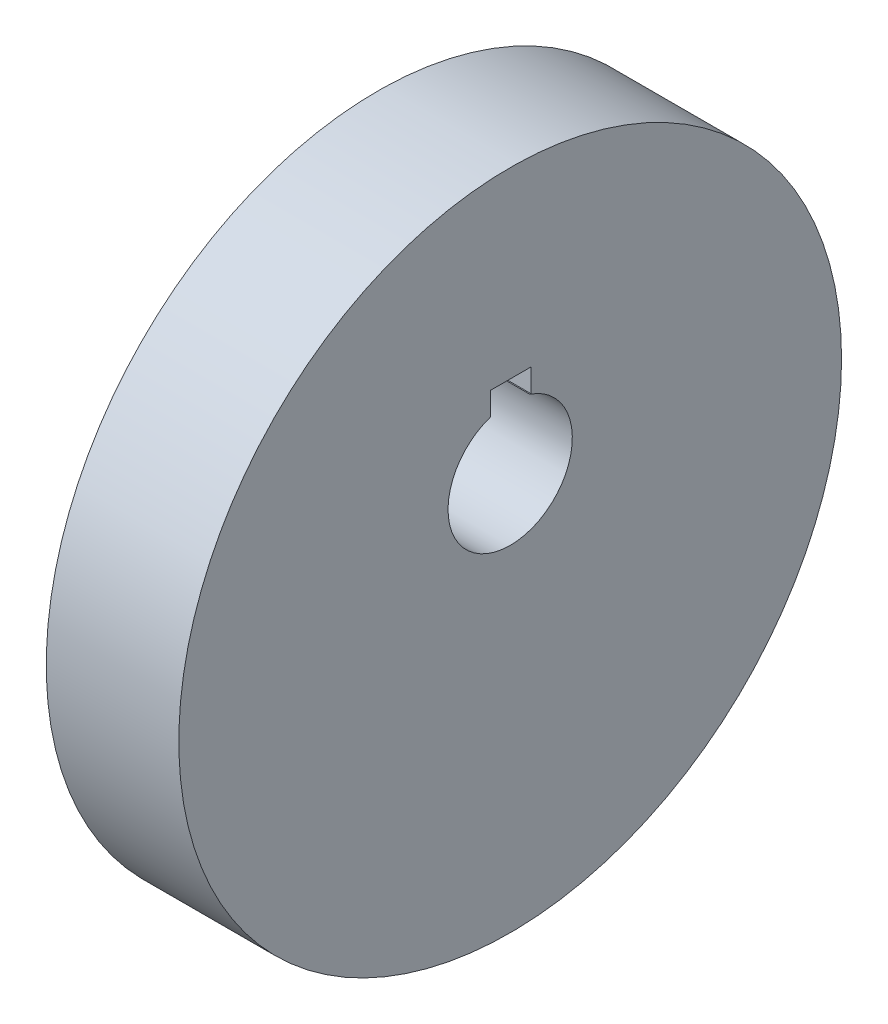
ISO-10303-21;
HEADER;
FILE_DESCRIPTION(('STEP AP214'),'2;1');
FILE_NAME('part.step','',(''),(''),'','','');
FILE_SCHEMA(('AUTOMOTIVE_DESIGN { 1 0 10303 214 1 1 1 1 }'));
ENDSEC;
DATA;
#1=APPLICATION_CONTEXT('core data for automotive mechanical design processes');
#2=APPLICATION_PROTOCOL_DEFINITION('international standard','automotive_design',2000,#1);
#3=PRODUCT_CONTEXT('',#1,'mechanical');
#4=PRODUCT('Part','Part','',(#3));
#5=PRODUCT_RELATED_PRODUCT_CATEGORY('part','',(#4));
#6=PRODUCT_DEFINITION_FORMATION('','',#4);
#7=PRODUCT_DEFINITION_CONTEXT('part definition',#1,'design');
#8=PRODUCT_DEFINITION('design','',#6,#7);
#9=PRODUCT_DEFINITION_SHAPE('','',#8);
#10=(LENGTH_UNIT() NAMED_UNIT(*) SI_UNIT(.MILLI.,.METRE.));
#11=(NAMED_UNIT(*) PLANE_ANGLE_UNIT() SI_UNIT($,.RADIAN.));
#12=(NAMED_UNIT(*) SI_UNIT($,.STERADIAN.) SOLID_ANGLE_UNIT());
#13=UNCERTAINTY_MEASURE_WITH_UNIT(LENGTH_MEASURE(1.E-05),#10,'distance_accuracy_value','');
#14=(GEOMETRIC_REPRESENTATION_CONTEXT(3) GLOBAL_UNCERTAINTY_ASSIGNED_CONTEXT((#13)) GLOBAL_UNIT_ASSIGNED_CONTEXT((#10,
#11,#12)) REPRESENTATION_CONTEXT('',''));
#15=CARTESIAN_POINT('',(0.,0.,0.));
#16=DIRECTION('',(0.,0.,1.));
#17=DIRECTION('',(1.,0.,0.));
#18=AXIS2_PLACEMENT_3D('',#15,#16,#17);
#19=CARTESIAN_POINT('',(10.16,0.,0.));
#20=DIRECTION('',(1.,0.,0.));
#21=DIRECTION('',(0.,0.,-1.));
#22=AXIS2_PLACEMENT_3D('',#19,#20,#21);
#23=PLANE('',#22);
#24=CARTESIAN_POINT('',(10.16,0.,0.));
#25=DIRECTION('',(1.,0.,0.));
#26=DIRECTION('',(0.,0.,-1.));
#27=AXIS2_PLACEMENT_3D('',#24,#25,#26);
#28=CIRCLE('',#27,25.4);
#29=CARTESIAN_POINT('',(10.16,0.,-25.4));
#30=VERTEX_POINT('',#29);
#31=EDGE_CURVE('E47',#30,#30,#28,.T.);
#32=ORIENTED_EDGE('',*,*,#31,.T.);
#33=EDGE_LOOP('',(#32));
#34=FACE_BOUND('',#33,.T.);
#35=DIRECTION('',(0.,1.,0.));
#36=VECTOR('',#35,1.);
#37=CARTESIAN_POINT('',(10.16,9.59810420696557,-1.5875));
#38=LINE('',#37,#36);
#39=CARTESIAN_POINT('',(10.16,9.59810420696557,-1.5875));
#40=VERTEX_POINT('',#39);
#41=CARTESIAN_POINT('',(10.16,11.3665,-1.5875));
#42=VERTEX_POINT('',#41);
#43=EDGE_CURVE('E92',#40,#42,#38,.T.);
#44=ORIENTED_EDGE('',*,*,#43,.F.);
#45=DIRECTION('',(0.,0.,-1.));
#46=VECTOR('',#45,1.);
#47=CARTESIAN_POINT('',(10.16,9.59810420696557,1.50603473565519));
#48=LINE('',#47,#46);
#49=CARTESIAN_POINT('',(10.16,9.59810420696557,-1.50603473565519));
#50=VERTEX_POINT('',#49);
#51=EDGE_CURVE('E83',#50,#40,#48,.T.);
#52=ORIENTED_EDGE('',*,*,#51,.F.);
#53=CARTESIAN_POINT('',(10.16,5.08,0.));
#54=DIRECTION('',(1.,0.,0.));
#55=DIRECTION('',(0.,0.,-1.));
#56=AXIS2_PLACEMENT_3D('',#53,#54,#55);
#57=CIRCLE('',#56,4.7625);
#58=CARTESIAN_POINT('',(10.16,9.59810420696557,1.50603473565519));
#59=VERTEX_POINT('',#58);
#60=EDGE_CURVE('E122',#59,#50,#57,.T.);
#61=ORIENTED_EDGE('',*,*,#60,.F.);
#62=DIRECTION('',(0.,-1.,0.));
#63=VECTOR('',#62,1.);
#64=CARTESIAN_POINT('',(10.16,9.59810420696557,1.50603473565519));
#65=LINE('',#64,#63);
#66=CARTESIAN_POINT('',(10.16,11.3665,1.50603473565519));
#67=VERTEX_POINT('',#66);
#68=EDGE_CURVE('E54',#67,#59,#65,.T.);
#69=ORIENTED_EDGE('',*,*,#68,.F.);
#70=DIRECTION('',(0.,0.,1.));
#71=VECTOR('',#70,1.);
#72=CARTESIAN_POINT('',(10.16,11.3665,1.50603473565519));
#73=LINE('',#72,#71);
#74=EDGE_CURVE('E104',#42,#67,#73,.T.);
#75=ORIENTED_EDGE('',*,*,#74,.F.);
#76=EDGE_LOOP('',(#44,#52,#61,#69,#75));
#77=FACE_BOUND('',#76,.T.);
#78=ADVANCED_FACE('F39',(#34,#77),#23,.T.);
#79=CARTESIAN_POINT('',(0.,0.,0.));
#80=DIRECTION('',(1.,0.,0.));
#81=DIRECTION('',(0.,0.,-1.));
#82=AXIS2_PLACEMENT_3D('',#79,#80,#81);
#83=PLANE('',#82);
#84=CARTESIAN_POINT('',(0.,0.,0.));
#85=DIRECTION('',(1.,0.,0.));
#86=DIRECTION('',(0.,0.,-1.));
#87=AXIS2_PLACEMENT_3D('',#84,#85,#86);
#88=CIRCLE('',#87,25.4);
#89=CARTESIAN_POINT('',(0.,0.,-25.4));
#90=VERTEX_POINT('',#89);
#91=EDGE_CURVE('E124',#90,#90,#88,.T.);
#92=ORIENTED_EDGE('',*,*,#91,.F.);
#93=EDGE_LOOP('',(#92));
#94=FACE_BOUND('',#93,.T.);
#95=DIRECTION('',(0.,0.,-1.));
#96=VECTOR('',#95,1.);
#97=CARTESIAN_POINT('',(0.,9.59810420696557,1.50603473565519));
#98=LINE('',#97,#96);
#99=CARTESIAN_POINT('',(0.,9.59810420696557,-1.50603473565519));
#100=VERTEX_POINT('',#99);
#101=CARTESIAN_POINT('',(0.,9.59810420696557,-1.5875));
#102=VERTEX_POINT('',#101);
#103=EDGE_CURVE('E110',#100,#102,#98,.T.);
#104=ORIENTED_EDGE('',*,*,#103,.T.);
#105=DIRECTION('',(0.,1.,0.));
#106=VECTOR('',#105,1.);
#107=CARTESIAN_POINT('',(0.,9.59810420696557,-1.5875));
#108=LINE('',#107,#106);
#109=CARTESIAN_POINT('',(0.,11.3665,-1.5875));
#110=VERTEX_POINT('',#109);
#111=EDGE_CURVE('E99',#102,#110,#108,.T.);
#112=ORIENTED_EDGE('',*,*,#111,.T.);
#113=DIRECTION('',(0.,0.,1.));
#114=VECTOR('',#113,1.);
#115=CARTESIAN_POINT('',(0.,11.3665,1.50603473565519));
#116=LINE('',#115,#114);
#117=CARTESIAN_POINT('',(0.,11.3665,1.50603473565519));
#118=VERTEX_POINT('',#117);
#119=EDGE_CURVE('E113',#110,#118,#116,.T.);
#120=ORIENTED_EDGE('',*,*,#119,.T.);
#121=DIRECTION('',(0.,-1.,0.));
#122=VECTOR('',#121,1.);
#123=CARTESIAN_POINT('',(0.,9.59810420696557,1.50603473565519));
#124=LINE('',#123,#122);
#125=CARTESIAN_POINT('',(0.,9.59810420696557,1.50603473565519));
#126=VERTEX_POINT('',#125);
#127=EDGE_CURVE('E93',#118,#126,#124,.T.);
#128=ORIENTED_EDGE('',*,*,#127,.T.);
#129=CARTESIAN_POINT('',(0.,5.08,0.));
#130=DIRECTION('',(1.,0.,0.));
#131=DIRECTION('',(0.,0.,-1.));
#132=AXIS2_PLACEMENT_3D('',#129,#130,#131);
#133=CIRCLE('',#132,4.7625);
#134=EDGE_CURVE('E100',#126,#100,#133,.T.);
#135=ORIENTED_EDGE('',*,*,#134,.T.);
#136=EDGE_LOOP('',(#104,#112,#120,#128,#135));
#137=FACE_BOUND('',#136,.T.);
#138=ADVANCED_FACE('F132',(#94,#137),#83,.F.);
#139=CARTESIAN_POINT('',(10.16,5.08,0.));
#140=DIRECTION('',(-1.,0.,0.));
#141=DIRECTION('',(0.,0.,1.));
#142=AXIS2_PLACEMENT_3D('',#139,#140,#141);
#143=CYLINDRICAL_SURFACE('',#142,4.7625);
#144=ORIENTED_EDGE('',*,*,#60,.T.);
#145=DIRECTION('',(-1.,0.,0.));
#146=VECTOR('',#145,1.);
#147=CARTESIAN_POINT('',(10.16,9.59810420696557,-1.50603473565519));
#148=LINE('',#147,#146);
#149=EDGE_CURVE('E11',#50,#100,#148,.T.);
#150=ORIENTED_EDGE('',*,*,#149,.T.);
#151=ORIENTED_EDGE('',*,*,#134,.F.);
#152=DIRECTION('',(-1.,0.,0.));
#153=VECTOR('',#152,1.);
#154=CARTESIAN_POINT('',(10.16,9.59810420696557,1.50603473565519));
#155=LINE('',#154,#153);
#156=EDGE_CURVE('E109',#59,#126,#155,.T.);
#157=ORIENTED_EDGE('',*,*,#156,.F.);
#158=EDGE_LOOP('',(#144,#150,#151,#157));
#159=FACE_BOUND('',#158,.T.);
#160=ADVANCED_FACE('F135',(#159),#143,.F.);
#161=CARTESIAN_POINT('',(10.16,0.,0.));
#162=DIRECTION('',(-1.,0.,0.));
#163=DIRECTION('',(0.,0.,1.));
#164=AXIS2_PLACEMENT_3D('',#161,#162,#163);
#165=CYLINDRICAL_SURFACE('',#164,25.4);
#166=ORIENTED_EDGE('',*,*,#31,.F.);
#167=EDGE_LOOP('',(#166));
#168=FACE_BOUND('',#167,.T.);
#169=ORIENTED_EDGE('',*,*,#91,.T.);
#170=EDGE_LOOP('',(#169));
#171=FACE_BOUND('',#170,.T.);
#172=ADVANCED_FACE('F41',(#168,#171),#165,.T.);
#173=CARTESIAN_POINT('',(10.16,9.59810420696557,1.50603473565519));
#174=DIRECTION('',(0.,1.,0.));
#175=DIRECTION('',(0.,0.,1.));
#176=AXIS2_PLACEMENT_3D('',#173,#174,#175);
#177=PLANE('',#176);
#178=ORIENTED_EDGE('',*,*,#51,.T.);
#179=DIRECTION('',(-1.,0.,0.));
#180=VECTOR('',#179,1.);
#181=CARTESIAN_POINT('',(10.16,9.59810420696557,-1.5875));
#182=LINE('',#181,#180);
#183=EDGE_CURVE('E86',#40,#102,#182,.T.);
#184=ORIENTED_EDGE('',*,*,#183,.T.);
#185=ORIENTED_EDGE('',*,*,#103,.F.);
#186=ORIENTED_EDGE('',*,*,#149,.F.);
#187=EDGE_LOOP('',(#178,#184,#185,#186));
#188=FACE_BOUND('',#187,.T.);
#189=ADVANCED_FACE('F85',(#188),#177,.T.);
#190=CARTESIAN_POINT('',(10.16,9.59810420696557,-1.5875));
#191=DIRECTION('',(0.,0.,1.));
#192=DIRECTION('',(1.,0.,0.));
#193=AXIS2_PLACEMENT_3D('',#190,#191,#192);
#194=PLANE('',#193);
#195=ORIENTED_EDGE('',*,*,#111,.F.);
#196=ORIENTED_EDGE('',*,*,#183,.F.);
#197=ORIENTED_EDGE('',*,*,#43,.T.);
#198=DIRECTION('',(-1.,0.,0.));
#199=VECTOR('',#198,1.);
#200=CARTESIAN_POINT('',(10.16,11.3665,-1.5875));
#201=LINE('',#200,#199);
#202=EDGE_CURVE('E101',#42,#110,#201,.T.);
#203=ORIENTED_EDGE('',*,*,#202,.T.);
#204=EDGE_LOOP('',(#195,#196,#197,#203));
#205=FACE_BOUND('',#204,.T.);
#206=ADVANCED_FACE('F96',(#205),#194,.T.);
#207=CARTESIAN_POINT('',(10.16,11.3665,1.50603473565519));
#208=DIRECTION('',(0.,-1.,0.));
#209=DIRECTION('',(0.,0.,-1.));
#210=AXIS2_PLACEMENT_3D('',#207,#208,#209);
#211=PLANE('',#210);
#212=ORIENTED_EDGE('',*,*,#119,.F.);
#213=ORIENTED_EDGE('',*,*,#202,.F.);
#214=ORIENTED_EDGE('',*,*,#74,.T.);
#215=DIRECTION('',(-1.,0.,0.));
#216=VECTOR('',#215,1.);
#217=CARTESIAN_POINT('',(10.16,11.3665,1.50603473565519));
#218=LINE('',#217,#216);
#219=EDGE_CURVE('E119',#67,#118,#218,.T.);
#220=ORIENTED_EDGE('',*,*,#219,.T.);
#221=EDGE_LOOP('',(#212,#213,#214,#220));
#222=FACE_BOUND('',#221,.T.);
#223=ADVANCED_FACE('F142',(#222),#211,.T.);
#224=CARTESIAN_POINT('',(10.16,9.59810420696557,1.50603473565519));
#225=DIRECTION('',(0.,0.,-1.));
#226=DIRECTION('',(-1.,0.,0.));
#227=AXIS2_PLACEMENT_3D('',#224,#225,#226);
#228=PLANE('',#227);
#229=ORIENTED_EDGE('',*,*,#127,.F.);
#230=ORIENTED_EDGE('',*,*,#219,.F.);
#231=ORIENTED_EDGE('',*,*,#68,.T.);
#232=ORIENTED_EDGE('',*,*,#156,.T.);
#233=EDGE_LOOP('',(#229,#230,#231,#232));
#234=FACE_BOUND('',#233,.T.);
#235=ADVANCED_FACE('F139',(#234),#228,.T.);
#236=CLOSED_SHELL('',(#78,#138,#160,#172,#189,#206,#223,#235));
#237=MANIFOLD_SOLID_BREP('B2',#236);
#238=ADVANCED_BREP_SHAPE_REPRESENTATION('',(#18,#237),#14);
#239=SHAPE_DEFINITION_REPRESENTATION(#9,#238);
ENDSEC;
END-ISO-10303-21;
